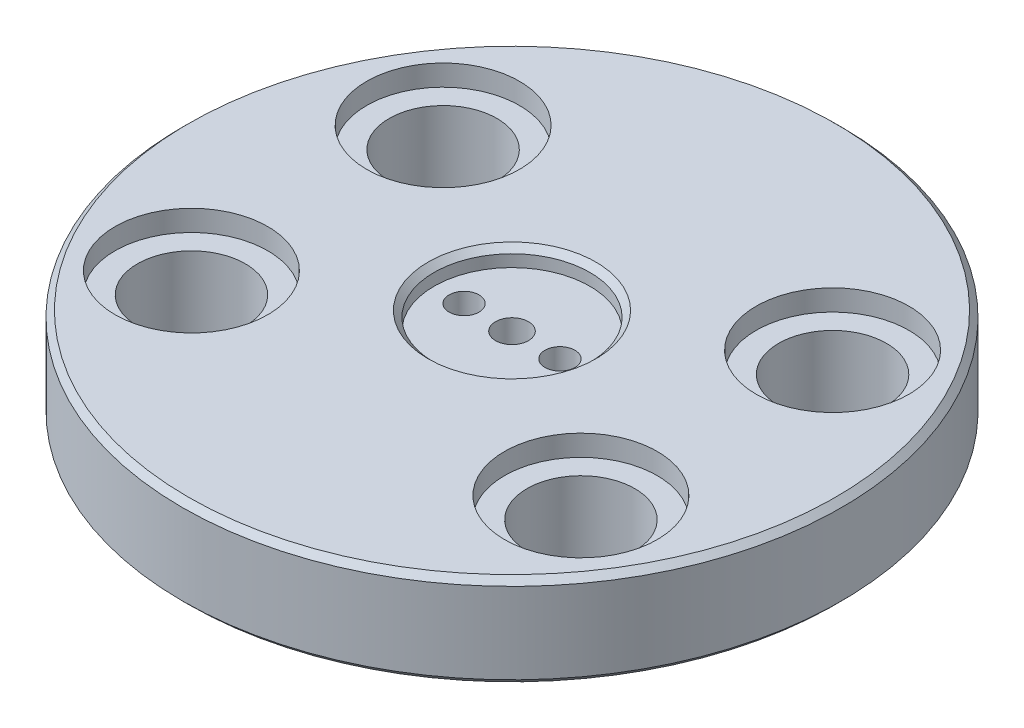
ISO-10303-21;
HEADER;
FILE_DESCRIPTION(('STEP AP214'),'2;1');
FILE_NAME('part.step','',(''),(''),'','','');
FILE_SCHEMA(('AUTOMOTIVE_DESIGN { 1 0 10303 214 1 1 1 1 }'));
ENDSEC;
DATA;
#1=APPLICATION_CONTEXT('core data for automotive mechanical design processes');
#2=APPLICATION_PROTOCOL_DEFINITION('international standard','automotive_design',2000,#1);
#3=PRODUCT_CONTEXT('',#1,'mechanical');
#4=PRODUCT('Part','Part','',(#3));
#5=PRODUCT_RELATED_PRODUCT_CATEGORY('part','',(#4));
#6=PRODUCT_DEFINITION_FORMATION('','',#4);
#7=PRODUCT_DEFINITION_CONTEXT('part definition',#1,'design');
#8=PRODUCT_DEFINITION('design','',#6,#7);
#9=PRODUCT_DEFINITION_SHAPE('','',#8);
#10=(LENGTH_UNIT() NAMED_UNIT(*) SI_UNIT(.MILLI.,.METRE.));
#11=(NAMED_UNIT(*) PLANE_ANGLE_UNIT() SI_UNIT($,.RADIAN.));
#12=(NAMED_UNIT(*) SI_UNIT($,.STERADIAN.) SOLID_ANGLE_UNIT());
#13=UNCERTAINTY_MEASURE_WITH_UNIT(LENGTH_MEASURE(1.E-05),#10,'distance_accuracy_value','');
#14=(GEOMETRIC_REPRESENTATION_CONTEXT(3) GLOBAL_UNCERTAINTY_ASSIGNED_CONTEXT((#13)) GLOBAL_UNIT_ASSIGNED_CONTEXT((#10,
#11,#12)) REPRESENTATION_CONTEXT('',''));
#15=CARTESIAN_POINT('',(0.,0.,0.));
#16=DIRECTION('',(0.,0.,1.));
#17=DIRECTION('',(1.,0.,0.));
#18=AXIS2_PLACEMENT_3D('',#15,#16,#17);
#19=CARTESIAN_POINT('',(0.,15.5,0.));
#20=DIRECTION('',(0.,-1.,0.));
#21=DIRECTION('',(0.,0.,-1.));
#22=AXIS2_PLACEMENT_3D('',#19,#20,#21);
#23=CYLINDRICAL_SURFACE('',#22,55.);
#24=CARTESIAN_POINT('',(0.,1.,0.));
#25=DIRECTION('',(0.,1.,0.));
#26=DIRECTION('',(0.,0.,1.));
#27=AXIS2_PLACEMENT_3D('',#24,#25,#26);
#28=CIRCLE('',#27,55.);
#29=CARTESIAN_POINT('',(0.,1.,55.));
#30=VERTEX_POINT('',#29);
#31=EDGE_CURVE('E49',#30,#30,#28,.T.);
#32=ORIENTED_EDGE('',*,*,#31,.T.);
#33=EDGE_LOOP('',(#32));
#34=FACE_BOUND('',#33,.T.);
#35=CARTESIAN_POINT('',(0.,14.5,0.));
#36=DIRECTION('',(0.,1.,0.));
#37=DIRECTION('',(0.,0.,1.));
#38=AXIS2_PLACEMENT_3D('',#35,#36,#37);
#39=CIRCLE('',#38,55.);
#40=CARTESIAN_POINT('',(0.,14.5,55.));
#41=VERTEX_POINT('',#40);
#42=EDGE_CURVE('E54',#41,#41,#39,.F.);
#43=ORIENTED_EDGE('',*,*,#42,.T.);
#44=EDGE_LOOP('',(#43));
#45=FACE_BOUND('',#44,.T.);
#46=ADVANCED_FACE('F39',(#34,#45),#23,.T.);
#47=CARTESIAN_POINT('',(0.,15.5,0.));
#48=DIRECTION('',(0.,1.,0.));
#49=DIRECTION('',(0.,0.,1.));
#50=AXIS2_PLACEMENT_3D('',#47,#48,#49);
#51=PLANE('',#50);
#52=CARTESIAN_POINT('',(0.,15.5,0.));
#53=DIRECTION('',(0.,1.,0.));
#54=DIRECTION('',(0.,0.,1.));
#55=AXIS2_PLACEMENT_3D('',#52,#53,#54);
#56=CIRCLE('',#55,14.);
#57=CARTESIAN_POINT('',(0.,15.5,14.));
#58=VERTEX_POINT('',#57);
#59=EDGE_CURVE('E60',#58,#58,#56,.F.);
#60=ORIENTED_EDGE('',*,*,#59,.T.);
#61=EDGE_LOOP('',(#60));
#62=FACE_BOUND('',#61,.T.);
#63=CARTESIAN_POINT('',(0.,15.5,0.));
#64=DIRECTION('',(0.,1.,0.));
#65=DIRECTION('',(0.,0.,1.));
#66=AXIS2_PLACEMENT_3D('',#63,#64,#65);
#67=CIRCLE('',#66,54.);
#68=CARTESIAN_POINT('',(0.,15.5,54.));
#69=VERTEX_POINT('',#68);
#70=EDGE_CURVE('E64',#69,#69,#67,.T.);
#71=ORIENTED_EDGE('',*,*,#70,.T.);
#72=EDGE_LOOP('',(#71));
#73=FACE_BOUND('',#72,.T.);
#74=CARTESIAN_POINT('',(-32.5,15.5,-21.));
#75=DIRECTION('',(0.,1.,0.));
#76=DIRECTION('',(0.,0.,1.));
#77=AXIS2_PLACEMENT_3D('',#74,#75,#76);
#78=CIRCLE('',#77,12.75);
#79=CARTESIAN_POINT('',(-32.5,15.5,-8.24999999999999));
#80=VERTEX_POINT('',#79);
#81=EDGE_CURVE('E132',#80,#80,#78,.T.);
#82=ORIENTED_EDGE('',*,*,#81,.F.);
#83=EDGE_LOOP('',(#82));
#84=FACE_BOUND('',#83,.T.);
#85=CARTESIAN_POINT('',(32.5,15.5,-21.));
#86=DIRECTION('',(0.,1.,0.));
#87=DIRECTION('',(0.,0.,1.));
#88=AXIS2_PLACEMENT_3D('',#85,#86,#87);
#89=CIRCLE('',#88,12.75);
#90=CARTESIAN_POINT('',(32.5,15.5,-8.24999999999999));
#91=VERTEX_POINT('',#90);
#92=EDGE_CURVE('E116',#91,#91,#89,.T.);
#93=ORIENTED_EDGE('',*,*,#92,.F.);
#94=EDGE_LOOP('',(#93));
#95=FACE_BOUND('',#94,.T.);
#96=CARTESIAN_POINT('',(32.5,15.5,21.));
#97=DIRECTION('',(0.,1.,0.));
#98=DIRECTION('',(0.,0.,1.));
#99=AXIS2_PLACEMENT_3D('',#96,#97,#98);
#100=CIRCLE('',#99,12.75);
#101=CARTESIAN_POINT('',(32.5,15.5,33.75));
#102=VERTEX_POINT('',#101);
#103=EDGE_CURVE('E100',#102,#102,#100,.T.);
#104=ORIENTED_EDGE('',*,*,#103,.F.);
#105=EDGE_LOOP('',(#104));
#106=FACE_BOUND('',#105,.T.);
#107=CARTESIAN_POINT('',(-32.5,15.5,21.));
#108=DIRECTION('',(0.,1.,0.));
#109=DIRECTION('',(0.,0.,1.));
#110=AXIS2_PLACEMENT_3D('',#107,#108,#109);
#111=CIRCLE('',#110,12.75);
#112=CARTESIAN_POINT('',(-32.5,15.5,33.75));
#113=VERTEX_POINT('',#112);
#114=EDGE_CURVE('E84',#113,#113,#111,.T.);
#115=ORIENTED_EDGE('',*,*,#114,.F.);
#116=EDGE_LOOP('',(#115));
#117=FACE_BOUND('',#116,.T.);
#118=ADVANCED_FACE('F174',(#62,#73,#84,#95,#106,#117),#51,.T.);
#119=CARTESIAN_POINT('',(0.,0.,0.));
#120=DIRECTION('',(0.,1.,0.));
#121=DIRECTION('',(0.,0.,1.));
#122=AXIS2_PLACEMENT_3D('',#119,#120,#121);
#123=PLANE('',#122);
#124=CARTESIAN_POINT('',(0.,0.,0.));
#125=DIRECTION('',(0.,-1.,0.));
#126=DIRECTION('',(0.,0.,-1.));
#127=AXIS2_PLACEMENT_3D('',#124,#125,#126);
#128=CIRCLE('',#127,4.49999999999999);
#129=CARTESIAN_POINT('',(0.,0.,-4.49999999999999));
#130=VERTEX_POINT('',#129);
#131=EDGE_CURVE('E164',#130,#130,#128,.T.);
#132=ORIENTED_EDGE('',*,*,#131,.F.);
#133=EDGE_LOOP('',(#132));
#134=FACE_BOUND('',#133,.T.);
#135=CARTESIAN_POINT('',(0.,0.,0.));
#136=DIRECTION('',(0.,1.,0.));
#137=DIRECTION('',(0.,0.,1.));
#138=AXIS2_PLACEMENT_3D('',#135,#136,#137);
#139=CIRCLE('',#138,54.);
#140=CARTESIAN_POINT('',(0.,0.,54.));
#141=VERTEX_POINT('',#140);
#142=EDGE_CURVE('E10',#141,#141,#139,.F.);
#143=ORIENTED_EDGE('',*,*,#142,.T.);
#144=EDGE_LOOP('',(#143));
#145=FACE_BOUND('',#144,.T.);
#146=CARTESIAN_POINT('',(-8.,0.,0.));
#147=DIRECTION('',(0.,1.,0.));
#148=DIRECTION('',(0.,0.,1.));
#149=AXIS2_PLACEMENT_3D('',#146,#147,#148);
#150=CIRCLE('',#149,2.5);
#151=CARTESIAN_POINT('',(-8.,0.,2.5));
#152=VERTEX_POINT('',#151);
#153=EDGE_CURVE('E148',#152,#152,#150,.T.);
#154=ORIENTED_EDGE('',*,*,#153,.T.);
#155=EDGE_LOOP('',(#154));
#156=FACE_BOUND('',#155,.T.);
#157=CARTESIAN_POINT('',(8.,0.,0.));
#158=DIRECTION('',(0.,1.,0.));
#159=DIRECTION('',(0.,0.,1.));
#160=AXIS2_PLACEMENT_3D('',#157,#158,#159);
#161=CIRCLE('',#160,2.5);
#162=CARTESIAN_POINT('',(8.,0.,2.5));
#163=VERTEX_POINT('',#162);
#164=EDGE_CURVE('E140',#163,#163,#161,.T.);
#165=ORIENTED_EDGE('',*,*,#164,.T.);
#166=EDGE_LOOP('',(#165));
#167=FACE_BOUND('',#166,.T.);
#168=CARTESIAN_POINT('',(-32.5,0.,-21.));
#169=DIRECTION('',(0.,1.,0.));
#170=DIRECTION('',(0.,0.,1.));
#171=AXIS2_PLACEMENT_3D('',#168,#169,#170);
#172=CIRCLE('',#171,9.);
#173=CARTESIAN_POINT('',(-32.5,0.,-12.));
#174=VERTEX_POINT('',#173);
#175=EDGE_CURVE('E120',#174,#174,#172,.T.);
#176=ORIENTED_EDGE('',*,*,#175,.T.);
#177=EDGE_LOOP('',(#176));
#178=FACE_BOUND('',#177,.T.);
#179=CARTESIAN_POINT('',(32.5,0.,-21.));
#180=DIRECTION('',(0.,1.,0.));
#181=DIRECTION('',(0.,0.,1.));
#182=AXIS2_PLACEMENT_3D('',#179,#180,#181);
#183=CIRCLE('',#182,9.);
#184=CARTESIAN_POINT('',(32.5,0.,-12.));
#185=VERTEX_POINT('',#184);
#186=EDGE_CURVE('E104',#185,#185,#183,.T.);
#187=ORIENTED_EDGE('',*,*,#186,.T.);
#188=EDGE_LOOP('',(#187));
#189=FACE_BOUND('',#188,.T.);
#190=CARTESIAN_POINT('',(32.5,0.,21.));
#191=DIRECTION('',(0.,1.,0.));
#192=DIRECTION('',(0.,0.,1.));
#193=AXIS2_PLACEMENT_3D('',#190,#191,#192);
#194=CIRCLE('',#193,8.99999999999999);
#195=CARTESIAN_POINT('',(32.5,0.,30.));
#196=VERTEX_POINT('',#195);
#197=EDGE_CURVE('E88',#196,#196,#194,.T.);
#198=ORIENTED_EDGE('',*,*,#197,.T.);
#199=EDGE_LOOP('',(#198));
#200=FACE_BOUND('',#199,.T.);
#201=CARTESIAN_POINT('',(-32.5,0.,21.));
#202=DIRECTION('',(0.,1.,0.));
#203=DIRECTION('',(0.,0.,1.));
#204=AXIS2_PLACEMENT_3D('',#201,#202,#203);
#205=CIRCLE('',#204,9.);
#206=CARTESIAN_POINT('',(-32.5,0.,30.));
#207=VERTEX_POINT('',#206);
#208=EDGE_CURVE('E72',#207,#207,#205,.T.);
#209=ORIENTED_EDGE('',*,*,#208,.T.);
#210=EDGE_LOOP('',(#209));
#211=FACE_BOUND('',#210,.T.);
#212=ADVANCED_FACE('F171',(#134,#145,#156,#167,#178,#189,#200,#211),#123,.F.);
#213=CARTESIAN_POINT('',(-32.5,15.5,21.));
#214=DIRECTION('',(0.,1.,0.));
#215=DIRECTION('',(0.,0.,1.));
#216=AXIS2_PLACEMENT_3D('',#213,#214,#215);
#217=CYLINDRICAL_SURFACE('',#216,9.);
#218=ORIENTED_EDGE('',*,*,#208,.F.);
#219=EDGE_LOOP('',(#218));
#220=FACE_BOUND('',#219,.T.);
#221=CARTESIAN_POINT('',(-32.5,12.,21.));
#222=DIRECTION('',(0.,1.,0.));
#223=DIRECTION('',(0.,0.,1.));
#224=AXIS2_PLACEMENT_3D('',#221,#222,#223);
#225=CIRCLE('',#224,9.);
#226=CARTESIAN_POINT('',(-32.5,12.,30.));
#227=VERTEX_POINT('',#226);
#228=EDGE_CURVE('E76',#227,#227,#225,.T.);
#229=ORIENTED_EDGE('',*,*,#228,.T.);
#230=EDGE_LOOP('',(#229));
#231=FACE_BOUND('',#230,.T.);
#232=ADVANCED_FACE('F173',(#220,#231),#217,.F.);
#233=CARTESIAN_POINT('',(-23.5,12.,21.));
#234=DIRECTION('',(0.,-1.,0.));
#235=DIRECTION('',(0.,0.,-1.));
#236=AXIS2_PLACEMENT_3D('',#233,#234,#235);
#237=PLANE('',#236);
#238=ORIENTED_EDGE('',*,*,#228,.F.);
#239=EDGE_LOOP('',(#238));
#240=FACE_BOUND('',#239,.T.);
#241=CARTESIAN_POINT('',(-32.5,12.,21.));
#242=DIRECTION('',(0.,1.,0.));
#243=DIRECTION('',(0.,0.,1.));
#244=AXIS2_PLACEMENT_3D('',#241,#242,#243);
#245=CIRCLE('',#244,12.75);
#246=CARTESIAN_POINT('',(-32.5,12.,33.75));
#247=VERTEX_POINT('',#246);
#248=EDGE_CURVE('E80',#247,#247,#245,.T.);
#249=ORIENTED_EDGE('',*,*,#248,.T.);
#250=EDGE_LOOP('',(#249));
#251=FACE_BOUND('',#250,.T.);
#252=ADVANCED_FACE('F191',(#240,#251),#237,.F.);
#253=CARTESIAN_POINT('',(-32.5,15.5,21.));
#254=DIRECTION('',(0.,1.,0.));
#255=DIRECTION('',(0.,0.,1.));
#256=AXIS2_PLACEMENT_3D('',#253,#254,#255);
#257=CYLINDRICAL_SURFACE('',#256,12.75);
#258=ORIENTED_EDGE('',*,*,#248,.F.);
#259=EDGE_LOOP('',(#258));
#260=FACE_BOUND('',#259,.T.);
#261=ORIENTED_EDGE('',*,*,#114,.T.);
#262=EDGE_LOOP('',(#261));
#263=FACE_BOUND('',#262,.T.);
#264=ADVANCED_FACE('F197',(#260,#263),#257,.F.);
#265=CARTESIAN_POINT('',(32.5,15.5,21.));
#266=DIRECTION('',(0.,1.,0.));
#267=DIRECTION('',(0.,0.,1.));
#268=AXIS2_PLACEMENT_3D('',#265,#266,#267);
#269=CYLINDRICAL_SURFACE('',#268,9.);
#270=ORIENTED_EDGE('',*,*,#197,.F.);
#271=EDGE_LOOP('',(#270));
#272=FACE_BOUND('',#271,.T.);
#273=CARTESIAN_POINT('',(32.5,12.,21.));
#274=DIRECTION('',(0.,1.,0.));
#275=DIRECTION('',(0.,0.,1.));
#276=AXIS2_PLACEMENT_3D('',#273,#274,#275);
#277=CIRCLE('',#276,9.);
#278=CARTESIAN_POINT('',(32.5,12.,30.));
#279=VERTEX_POINT('',#278);
#280=EDGE_CURVE('E92',#279,#279,#277,.T.);
#281=ORIENTED_EDGE('',*,*,#280,.T.);
#282=EDGE_LOOP('',(#281));
#283=FACE_BOUND('',#282,.T.);
#284=ADVANCED_FACE('F203',(#272,#283),#269,.F.);
#285=CARTESIAN_POINT('',(41.5,12.,21.));
#286=DIRECTION('',(0.,-1.,0.));
#287=DIRECTION('',(0.,0.,-1.));
#288=AXIS2_PLACEMENT_3D('',#285,#286,#287);
#289=PLANE('',#288);
#290=ORIENTED_EDGE('',*,*,#280,.F.);
#291=EDGE_LOOP('',(#290));
#292=FACE_BOUND('',#291,.T.);
#293=CARTESIAN_POINT('',(32.5,12.,21.));
#294=DIRECTION('',(0.,1.,0.));
#295=DIRECTION('',(0.,0.,1.));
#296=AXIS2_PLACEMENT_3D('',#293,#294,#295);
#297=CIRCLE('',#296,12.75);
#298=CARTESIAN_POINT('',(32.5,12.,33.75));
#299=VERTEX_POINT('',#298);
#300=EDGE_CURVE('E96',#299,#299,#297,.T.);
#301=ORIENTED_EDGE('',*,*,#300,.T.);
#302=EDGE_LOOP('',(#301));
#303=FACE_BOUND('',#302,.T.);
#304=ADVANCED_FACE('F248',(#292,#303),#289,.F.);
#305=CARTESIAN_POINT('',(32.5,15.5,21.));
#306=DIRECTION('',(0.,1.,0.));
#307=DIRECTION('',(0.,0.,1.));
#308=AXIS2_PLACEMENT_3D('',#305,#306,#307);
#309=CYLINDRICAL_SURFACE('',#308,12.75);
#310=ORIENTED_EDGE('',*,*,#300,.F.);
#311=EDGE_LOOP('',(#310));
#312=FACE_BOUND('',#311,.T.);
#313=ORIENTED_EDGE('',*,*,#103,.T.);
#314=EDGE_LOOP('',(#313));
#315=FACE_BOUND('',#314,.T.);
#316=ADVANCED_FACE('F245',(#312,#315),#309,.F.);
#317=CARTESIAN_POINT('',(32.5,15.5,-21.));
#318=DIRECTION('',(0.,1.,0.));
#319=DIRECTION('',(0.,0.,1.));
#320=AXIS2_PLACEMENT_3D('',#317,#318,#319);
#321=CYLINDRICAL_SURFACE('',#320,9.);
#322=ORIENTED_EDGE('',*,*,#186,.F.);
#323=EDGE_LOOP('',(#322));
#324=FACE_BOUND('',#323,.T.);
#325=CARTESIAN_POINT('',(32.5,12.,-21.));
#326=DIRECTION('',(0.,1.,0.));
#327=DIRECTION('',(0.,0.,1.));
#328=AXIS2_PLACEMENT_3D('',#325,#326,#327);
#329=CIRCLE('',#328,9.);
#330=CARTESIAN_POINT('',(32.5,12.,-12.));
#331=VERTEX_POINT('',#330);
#332=EDGE_CURVE('E108',#331,#331,#329,.T.);
#333=ORIENTED_EDGE('',*,*,#332,.T.);
#334=EDGE_LOOP('',(#333));
#335=FACE_BOUND('',#334,.T.);
#336=ADVANCED_FACE('F247',(#324,#335),#321,.F.);
#337=CARTESIAN_POINT('',(41.5,12.,-21.));
#338=DIRECTION('',(0.,-1.,0.));
#339=DIRECTION('',(0.,0.,-1.));
#340=AXIS2_PLACEMENT_3D('',#337,#338,#339);
#341=PLANE('',#340);
#342=ORIENTED_EDGE('',*,*,#332,.F.);
#343=EDGE_LOOP('',(#342));
#344=FACE_BOUND('',#343,.T.);
#345=CARTESIAN_POINT('',(32.5,12.,-21.));
#346=DIRECTION('',(0.,1.,0.));
#347=DIRECTION('',(0.,0.,1.));
#348=AXIS2_PLACEMENT_3D('',#345,#346,#347);
#349=CIRCLE('',#348,12.75);
#350=CARTESIAN_POINT('',(32.5,12.,-8.24999999999999));
#351=VERTEX_POINT('',#350);
#352=EDGE_CURVE('E112',#351,#351,#349,.T.);
#353=ORIENTED_EDGE('',*,*,#352,.T.);
#354=EDGE_LOOP('',(#353));
#355=FACE_BOUND('',#354,.T.);
#356=ADVANCED_FACE('F255',(#344,#355),#341,.F.);
#357=CARTESIAN_POINT('',(32.5,15.5,-21.));
#358=DIRECTION('',(0.,1.,0.));
#359=DIRECTION('',(0.,0.,1.));
#360=AXIS2_PLACEMENT_3D('',#357,#358,#359);
#361=CYLINDRICAL_SURFACE('',#360,12.75);
#362=ORIENTED_EDGE('',*,*,#352,.F.);
#363=EDGE_LOOP('',(#362));
#364=FACE_BOUND('',#363,.T.);
#365=ORIENTED_EDGE('',*,*,#92,.T.);
#366=EDGE_LOOP('',(#365));
#367=FACE_BOUND('',#366,.T.);
#368=ADVANCED_FACE('F295',(#364,#367),#361,.F.);
#369=CARTESIAN_POINT('',(-32.5,15.5,-21.));
#370=DIRECTION('',(0.,1.,0.));
#371=DIRECTION('',(0.,0.,1.));
#372=AXIS2_PLACEMENT_3D('',#369,#370,#371);
#373=CYLINDRICAL_SURFACE('',#372,9.);
#374=ORIENTED_EDGE('',*,*,#175,.F.);
#375=EDGE_LOOP('',(#374));
#376=FACE_BOUND('',#375,.T.);
#377=CARTESIAN_POINT('',(-32.5,12.,-21.));
#378=DIRECTION('',(0.,1.,0.));
#379=DIRECTION('',(0.,0.,1.));
#380=AXIS2_PLACEMENT_3D('',#377,#378,#379);
#381=CIRCLE('',#380,9.);
#382=CARTESIAN_POINT('',(-32.5,12.,-12.));
#383=VERTEX_POINT('',#382);
#384=EDGE_CURVE('E124',#383,#383,#381,.T.);
#385=ORIENTED_EDGE('',*,*,#384,.T.);
#386=EDGE_LOOP('',(#385));
#387=FACE_BOUND('',#386,.T.);
#388=ADVANCED_FACE('F304',(#376,#387),#373,.F.);
#389=CARTESIAN_POINT('',(-23.5,12.,-21.));
#390=DIRECTION('',(0.,-1.,0.));
#391=DIRECTION('',(0.,0.,-1.));
#392=AXIS2_PLACEMENT_3D('',#389,#390,#391);
#393=PLANE('',#392);
#394=ORIENTED_EDGE('',*,*,#384,.F.);
#395=EDGE_LOOP('',(#394));
#396=FACE_BOUND('',#395,.T.);
#397=CARTESIAN_POINT('',(-32.5,12.,-21.));
#398=DIRECTION('',(0.,1.,0.));
#399=DIRECTION('',(0.,0.,1.));
#400=AXIS2_PLACEMENT_3D('',#397,#398,#399);
#401=CIRCLE('',#400,12.75);
#402=CARTESIAN_POINT('',(-32.5,12.,-8.24999999999999));
#403=VERTEX_POINT('',#402);
#404=EDGE_CURVE('E128',#403,#403,#401,.T.);
#405=ORIENTED_EDGE('',*,*,#404,.T.);
#406=EDGE_LOOP('',(#405));
#407=FACE_BOUND('',#406,.T.);
#408=ADVANCED_FACE('F314',(#396,#407),#393,.F.);
#409=CARTESIAN_POINT('',(-32.5,15.5,-21.));
#410=DIRECTION('',(0.,1.,0.));
#411=DIRECTION('',(0.,0.,1.));
#412=AXIS2_PLACEMENT_3D('',#409,#410,#411);
#413=CYLINDRICAL_SURFACE('',#412,12.75);
#414=ORIENTED_EDGE('',*,*,#404,.F.);
#415=EDGE_LOOP('',(#414));
#416=FACE_BOUND('',#415,.T.);
#417=ORIENTED_EDGE('',*,*,#81,.T.);
#418=EDGE_LOOP('',(#417));
#419=FACE_BOUND('',#418,.T.);
#420=ADVANCED_FACE('F324',(#416,#419),#413,.F.);
#421=CARTESIAN_POINT('',(0.,12.5,0.));
#422=DIRECTION('',(0.,1.,0.));
#423=DIRECTION('',(0.,0.,1.));
#424=AXIS2_PLACEMENT_3D('',#421,#422,#423);
#425=CYLINDRICAL_SURFACE('',#424,13.);
#426=CARTESIAN_POINT('',(0.,14.5,0.));
#427=DIRECTION('',(0.,1.,0.));
#428=DIRECTION('',(0.,0.,1.));
#429=AXIS2_PLACEMENT_3D('',#426,#427,#428);
#430=CIRCLE('',#429,13.);
#431=CARTESIAN_POINT('',(0.,14.5,13.));
#432=VERTEX_POINT('',#431);
#433=EDGE_CURVE('E68',#432,#432,#430,.T.);
#434=ORIENTED_EDGE('',*,*,#433,.T.);
#435=EDGE_LOOP('',(#434));
#436=FACE_BOUND('',#435,.T.);
#437=CARTESIAN_POINT('',(0.,12.5,0.));
#438=DIRECTION('',(0.,1.,0.));
#439=DIRECTION('',(0.,0.,1.));
#440=AXIS2_PLACEMENT_3D('',#437,#438,#439);
#441=CIRCLE('',#440,13.);
#442=CARTESIAN_POINT('',(0.,12.5,13.));
#443=VERTEX_POINT('',#442);
#444=EDGE_CURVE('E136',#443,#443,#441,.T.);
#445=ORIENTED_EDGE('',*,*,#444,.F.);
#446=EDGE_LOOP('',(#445));
#447=FACE_BOUND('',#446,.T.);
#448=ADVANCED_FACE('F334',(#436,#447),#425,.F.);
#449=CARTESIAN_POINT('',(0.,12.5,0.));
#450=DIRECTION('',(0.,1.,0.));
#451=DIRECTION('',(0.,0.,1.));
#452=AXIS2_PLACEMENT_3D('',#449,#450,#451);
#453=PLANE('',#452);
#454=CARTESIAN_POINT('',(0.,12.5,0.));
#455=DIRECTION('',(0.,1.,0.));
#456=DIRECTION('',(0.,0.,1.));
#457=AXIS2_PLACEMENT_3D('',#454,#455,#456);
#458=CIRCLE('',#457,2.75);
#459=CARTESIAN_POINT('',(0.,12.5,2.75));
#460=VERTEX_POINT('',#459);
#461=EDGE_CURVE('E44',#460,#460,#458,.T.);
#462=ORIENTED_EDGE('',*,*,#461,.F.);
#463=EDGE_LOOP('',(#462));
#464=FACE_BOUND('',#463,.T.);
#465=CARTESIAN_POINT('',(-8.,12.5,0.));
#466=DIRECTION('',(0.,1.,0.));
#467=DIRECTION('',(0.,0.,1.));
#468=AXIS2_PLACEMENT_3D('',#465,#466,#467);
#469=CIRCLE('',#468,2.5);
#470=CARTESIAN_POINT('',(-8.,12.5,2.5));
#471=VERTEX_POINT('',#470);
#472=EDGE_CURVE('E152',#471,#471,#469,.T.);
#473=ORIENTED_EDGE('',*,*,#472,.F.);
#474=EDGE_LOOP('',(#473));
#475=FACE_BOUND('',#474,.T.);
#476=CARTESIAN_POINT('',(8.,12.5,0.));
#477=DIRECTION('',(0.,1.,0.));
#478=DIRECTION('',(0.,0.,1.));
#479=AXIS2_PLACEMENT_3D('',#476,#477,#478);
#480=CIRCLE('',#479,2.5);
#481=CARTESIAN_POINT('',(8.,12.5,2.5));
#482=VERTEX_POINT('',#481);
#483=EDGE_CURVE('E144',#482,#482,#480,.T.);
#484=ORIENTED_EDGE('',*,*,#483,.F.);
#485=EDGE_LOOP('',(#484));
#486=FACE_BOUND('',#485,.T.);
#487=ORIENTED_EDGE('',*,*,#444,.T.);
#488=EDGE_LOOP('',(#487));
#489=FACE_BOUND('',#488,.T.);
#490=ADVANCED_FACE('F347',(#464,#475,#486,#489),#453,.T.);
#491=CARTESIAN_POINT('',(8.,12.5,0.));
#492=DIRECTION('',(0.,1.,0.));
#493=DIRECTION('',(0.,0.,1.));
#494=AXIS2_PLACEMENT_3D('',#491,#492,#493);
#495=CYLINDRICAL_SURFACE('',#494,2.5);
#496=ORIENTED_EDGE('',*,*,#164,.F.);
#497=EDGE_LOOP('',(#496));
#498=FACE_BOUND('',#497,.T.);
#499=ORIENTED_EDGE('',*,*,#483,.T.);
#500=EDGE_LOOP('',(#499));
#501=FACE_BOUND('',#500,.T.);
#502=ADVANCED_FACE('F342',(#498,#501),#495,.F.);
#503=CARTESIAN_POINT('',(-8.,12.5,0.));
#504=DIRECTION('',(0.,1.,0.));
#505=DIRECTION('',(0.,0.,1.));
#506=AXIS2_PLACEMENT_3D('',#503,#504,#505);
#507=CYLINDRICAL_SURFACE('',#506,2.5);
#508=ORIENTED_EDGE('',*,*,#153,.F.);
#509=EDGE_LOOP('',(#508));
#510=FACE_BOUND('',#509,.T.);
#511=ORIENTED_EDGE('',*,*,#472,.T.);
#512=EDGE_LOOP('',(#511));
#513=FACE_BOUND('',#512,.T.);
#514=ADVANCED_FACE('F224',(#510,#513),#507,.F.);
#515=CARTESIAN_POINT('',(0.,14.5,0.));
#516=DIRECTION('',(0.,1.,0.));
#517=DIRECTION('',(0.,0.,1.));
#518=AXIS2_PLACEMENT_3D('',#515,#516,#517);
#519=CONICAL_SURFACE('',#518,13.,0.785398163397454);
#520=ORIENTED_EDGE('',*,*,#59,.F.);
#521=EDGE_LOOP('',(#520));
#522=FACE_BOUND('',#521,.T.);
#523=ORIENTED_EDGE('',*,*,#433,.F.);
#524=EDGE_LOOP('',(#523));
#525=FACE_BOUND('',#524,.T.);
#526=ADVANCED_FACE('F218',(#522,#525),#519,.F.);
#527=CARTESIAN_POINT('',(0.,15.5,0.));
#528=DIRECTION('',(0.,-1.,0.));
#529=DIRECTION('',(0.,0.,-1.));
#530=AXIS2_PLACEMENT_3D('',#527,#528,#529);
#531=CONICAL_SURFACE('',#530,54.,0.785398163397448);
#532=ORIENTED_EDGE('',*,*,#42,.F.);
#533=EDGE_LOOP('',(#532));
#534=FACE_BOUND('',#533,.T.);
#535=ORIENTED_EDGE('',*,*,#70,.F.);
#536=EDGE_LOOP('',(#535));
#537=FACE_BOUND('',#536,.T.);
#538=ADVANCED_FACE('F223',(#534,#537),#531,.T.);
#539=CARTESIAN_POINT('',(0.,1.,0.));
#540=DIRECTION('',(0.,1.,0.));
#541=DIRECTION('',(0.,0.,1.));
#542=AXIS2_PLACEMENT_3D('',#539,#540,#541);
#543=CONICAL_SURFACE('',#542,55.,0.785398163397448);
#544=ORIENTED_EDGE('',*,*,#142,.F.);
#545=EDGE_LOOP('',(#544));
#546=FACE_BOUND('',#545,.T.);
#547=ORIENTED_EDGE('',*,*,#31,.F.);
#548=EDGE_LOOP('',(#547));
#549=FACE_BOUND('',#548,.T.);
#550=ADVANCED_FACE('F42',(#546,#549),#543,.T.);
#551=CARTESIAN_POINT('',(0.,0.,0.));
#552=DIRECTION('',(0.,-1.,0.));
#553=DIRECTION('',(0.,0.,-1.));
#554=AXIS2_PLACEMENT_3D('',#551,#552,#553);
#555=CYLINDRICAL_SURFACE('',#554,2.75);
#556=ORIENTED_EDGE('',*,*,#461,.T.);
#557=EDGE_LOOP('',(#556));
#558=FACE_BOUND('',#557,.T.);
#559=CARTESIAN_POINT('',(0.,6.,0.));
#560=DIRECTION('',(0.,-1.,0.));
#561=DIRECTION('',(0.,0.,-1.));
#562=AXIS2_PLACEMENT_3D('',#559,#560,#561);
#563=CIRCLE('',#562,2.75);
#564=CARTESIAN_POINT('',(0.,6.,-2.75));
#565=VERTEX_POINT('',#564);
#566=EDGE_CURVE('E156',#565,#565,#563,.T.);
#567=ORIENTED_EDGE('',*,*,#566,.T.);
#568=EDGE_LOOP('',(#567));
#569=FACE_BOUND('',#568,.T.);
#570=ADVANCED_FACE('F233',(#558,#569),#555,.F.);
#571=CARTESIAN_POINT('',(2.75,6.,0.));
#572=DIRECTION('',(0.,1.,0.));
#573=DIRECTION('',(0.,0.,1.));
#574=AXIS2_PLACEMENT_3D('',#571,#572,#573);
#575=PLANE('',#574);
#576=ORIENTED_EDGE('',*,*,#566,.F.);
#577=EDGE_LOOP('',(#576));
#578=FACE_BOUND('',#577,.T.);
#579=CARTESIAN_POINT('',(0.,6.,0.));
#580=DIRECTION('',(0.,-1.,0.));
#581=DIRECTION('',(0.,0.,-1.));
#582=AXIS2_PLACEMENT_3D('',#579,#580,#581);
#583=CIRCLE('',#582,4.5);
#584=CARTESIAN_POINT('',(0.,6.,-4.5));
#585=VERTEX_POINT('',#584);
#586=EDGE_CURVE('E160',#585,#585,#583,.T.);
#587=ORIENTED_EDGE('',*,*,#586,.T.);
#588=EDGE_LOOP('',(#587));
#589=FACE_BOUND('',#588,.T.);
#590=ADVANCED_FACE('F415',(#578,#589),#575,.F.);
#591=CARTESIAN_POINT('',(0.,0.,0.));
#592=DIRECTION('',(0.,-1.,0.));
#593=DIRECTION('',(0.,0.,-1.));
#594=AXIS2_PLACEMENT_3D('',#591,#592,#593);
#595=CYLINDRICAL_SURFACE('',#594,4.5);
#596=ORIENTED_EDGE('',*,*,#586,.F.);
#597=EDGE_LOOP('',(#596));
#598=FACE_BOUND('',#597,.T.);
#599=ORIENTED_EDGE('',*,*,#131,.T.);
#600=EDGE_LOOP('',(#599));
#601=FACE_BOUND('',#600,.T.);
#602=ADVANCED_FACE('F169',(#598,#601),#595,.F.);
#603=CLOSED_SHELL('',(#46,#118,#212,#232,#252,#264,#284,#304,#316,#336,#356,#368,#388,#408,#420,
#448,#490,#502,#514,#526,#538,#550,#570,#590,#602));
#604=MANIFOLD_SOLID_BREP('B2',#603);
#605=ADVANCED_BREP_SHAPE_REPRESENTATION('',(#18,#604),#14);
#606=SHAPE_DEFINITION_REPRESENTATION(#9,#605);
ENDSEC;
END-ISO-10303-21;
